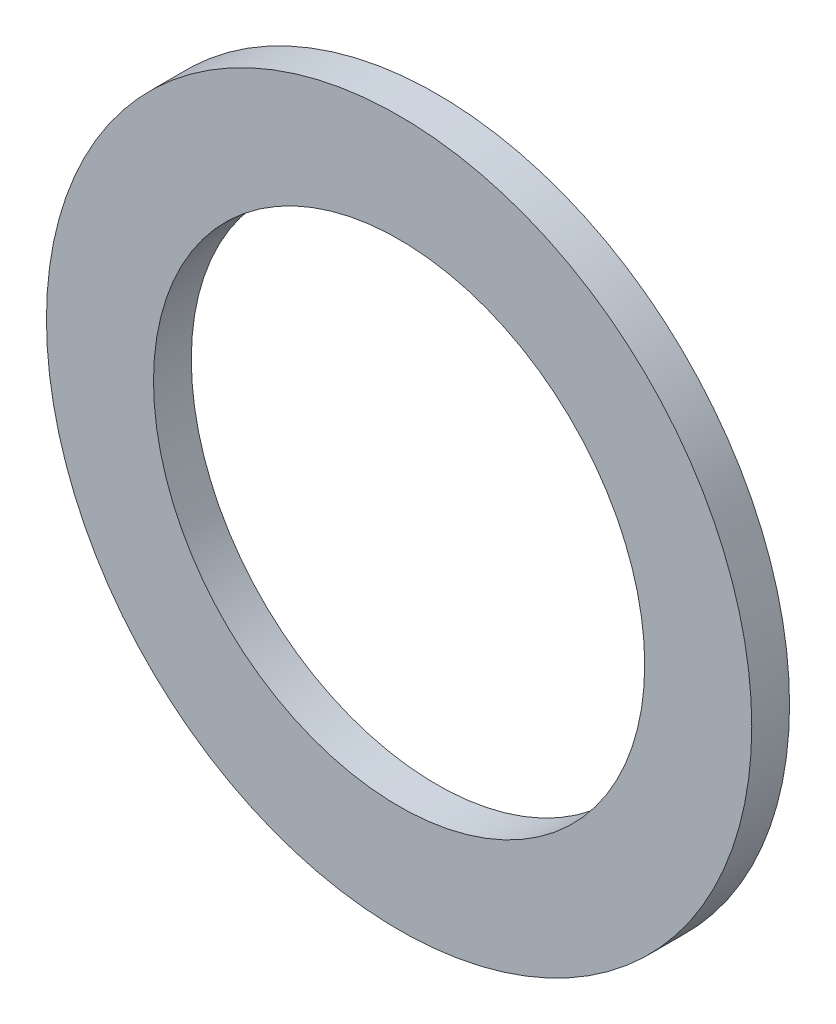
ISO-10303-21;
HEADER;
FILE_DESCRIPTION(('STEP AP214'),'2;1');
FILE_NAME('part.step','',(''),(''),'','','');
FILE_SCHEMA(('AUTOMOTIVE_DESIGN { 1 0 10303 214 1 1 1 1 }'));
ENDSEC;
DATA;
#1=APPLICATION_CONTEXT('core data for automotive mechanical design processes');
#2=APPLICATION_PROTOCOL_DEFINITION('international standard','automotive_design',2000,#1);
#3=PRODUCT_CONTEXT('',#1,'mechanical');
#4=PRODUCT('Part','Part','',(#3));
#5=PRODUCT_RELATED_PRODUCT_CATEGORY('part','',(#4));
#6=PRODUCT_DEFINITION_FORMATION('','',#4);
#7=PRODUCT_DEFINITION_CONTEXT('part definition',#1,'design');
#8=PRODUCT_DEFINITION('design','',#6,#7);
#9=PRODUCT_DEFINITION_SHAPE('','',#8);
#10=(LENGTH_UNIT() NAMED_UNIT(*) SI_UNIT(.MILLI.,.METRE.));
#11=(NAMED_UNIT(*) PLANE_ANGLE_UNIT() SI_UNIT($,.RADIAN.));
#12=(NAMED_UNIT(*) SI_UNIT($,.STERADIAN.) SOLID_ANGLE_UNIT());
#13=UNCERTAINTY_MEASURE_WITH_UNIT(LENGTH_MEASURE(1.E-05),#10,'distance_accuracy_value','');
#14=(GEOMETRIC_REPRESENTATION_CONTEXT(3) GLOBAL_UNCERTAINTY_ASSIGNED_CONTEXT((#13)) GLOBAL_UNIT_ASSIGNED_CONTEXT((#10,
#11,#12)) REPRESENTATION_CONTEXT('',''));
#15=CARTESIAN_POINT('',(0.,0.,0.));
#16=DIRECTION('',(0.,0.,1.));
#17=DIRECTION('',(1.,0.,0.));
#18=AXIS2_PLACEMENT_3D('',#15,#16,#17);
#19=CARTESIAN_POINT('',(0.,0.,1.5));
#20=DIRECTION('',(0.,0.,1.));
#21=DIRECTION('',(1.,0.,0.));
#22=AXIS2_PLACEMENT_3D('',#19,#20,#21);
#23=PLANE('',#22);
#24=CARTESIAN_POINT('',(0.,0.,1.5));
#25=DIRECTION('',(0.,0.,1.));
#26=DIRECTION('',(1.,0.,0.));
#27=AXIS2_PLACEMENT_3D('',#24,#25,#26);
#28=CIRCLE('',#27,14.);
#29=CARTESIAN_POINT('',(14.,0.,1.5));
#30=VERTEX_POINT('',#29);
#31=EDGE_CURVE('E10',#30,#30,#28,.T.);
#32=ORIENTED_EDGE('',*,*,#31,.T.);
#33=EDGE_LOOP('',(#32));
#34=FACE_BOUND('',#33,.T.);
#35=CARTESIAN_POINT('',(0.,0.,1.5));
#36=DIRECTION('',(0.,0.,1.));
#37=DIRECTION('',(1.,0.,0.));
#38=AXIS2_PLACEMENT_3D('',#35,#36,#37);
#39=CIRCLE('',#38,9.75);
#40=CARTESIAN_POINT('',(9.75,0.,1.5));
#41=VERTEX_POINT('',#40);
#42=EDGE_CURVE('E38',#41,#41,#39,.T.);
#43=ORIENTED_EDGE('',*,*,#42,.F.);
#44=EDGE_LOOP('',(#43));
#45=FACE_BOUND('',#44,.T.);
#46=ADVANCED_FACE('F27',(#34,#45),#23,.T.);
#47=CARTESIAN_POINT('',(0.,0.,0.));
#48=DIRECTION('',(0.,0.,1.));
#49=DIRECTION('',(1.,0.,0.));
#50=AXIS2_PLACEMENT_3D('',#47,#48,#49);
#51=PLANE('',#50);
#52=CARTESIAN_POINT('',(0.,0.,0.));
#53=DIRECTION('',(0.,0.,1.));
#54=DIRECTION('',(1.,0.,0.));
#55=AXIS2_PLACEMENT_3D('',#52,#53,#54);
#56=CIRCLE('',#55,14.);
#57=CARTESIAN_POINT('',(14.,0.,0.));
#58=VERTEX_POINT('',#57);
#59=EDGE_CURVE('E34',#58,#58,#56,.T.);
#60=ORIENTED_EDGE('',*,*,#59,.F.);
#61=EDGE_LOOP('',(#60));
#62=FACE_BOUND('',#61,.T.);
#63=CARTESIAN_POINT('',(0.,0.,0.));
#64=DIRECTION('',(0.,0.,1.));
#65=DIRECTION('',(1.,0.,0.));
#66=AXIS2_PLACEMENT_3D('',#63,#64,#65);
#67=CIRCLE('',#66,9.75);
#68=CARTESIAN_POINT('',(9.75,0.,0.));
#69=VERTEX_POINT('',#68);
#70=EDGE_CURVE('E42',#69,#69,#67,.T.);
#71=ORIENTED_EDGE('',*,*,#70,.T.);
#72=EDGE_LOOP('',(#71));
#73=FACE_BOUND('',#72,.T.);
#74=ADVANCED_FACE('F48',(#62,#73),#51,.F.);
#75=CARTESIAN_POINT('',(0.,0.,1.5));
#76=DIRECTION('',(0.,0.,-1.));
#77=DIRECTION('',(-1.,0.,0.));
#78=AXIS2_PLACEMENT_3D('',#75,#76,#77);
#79=CYLINDRICAL_SURFACE('',#78,14.);
#80=ORIENTED_EDGE('',*,*,#31,.F.);
#81=EDGE_LOOP('',(#80));
#82=FACE_BOUND('',#81,.T.);
#83=ORIENTED_EDGE('',*,*,#59,.T.);
#84=EDGE_LOOP('',(#83));
#85=FACE_BOUND('',#84,.T.);
#86=ADVANCED_FACE('F29',(#82,#85),#79,.T.);
#87=CARTESIAN_POINT('',(0.,0.,1.5));
#88=DIRECTION('',(0.,0.,-1.));
#89=DIRECTION('',(-1.,0.,0.));
#90=AXIS2_PLACEMENT_3D('',#87,#88,#89);
#91=CYLINDRICAL_SURFACE('',#90,9.75);
#92=ORIENTED_EDGE('',*,*,#42,.T.);
#93=EDGE_LOOP('',(#92));
#94=FACE_BOUND('',#93,.T.);
#95=ORIENTED_EDGE('',*,*,#70,.F.);
#96=EDGE_LOOP('',(#95));
#97=FACE_BOUND('',#96,.T.);
#98=ADVANCED_FACE('F50',(#94,#97),#91,.F.);
#99=CLOSED_SHELL('',(#46,#74,#86,#98));
#100=MANIFOLD_SOLID_BREP('B2',#99);
#101=ADVANCED_BREP_SHAPE_REPRESENTATION('',(#18,#100),#14);
#102=SHAPE_DEFINITION_REPRESENTATION(#9,#101);
ENDSEC;
END-ISO-10303-21;
